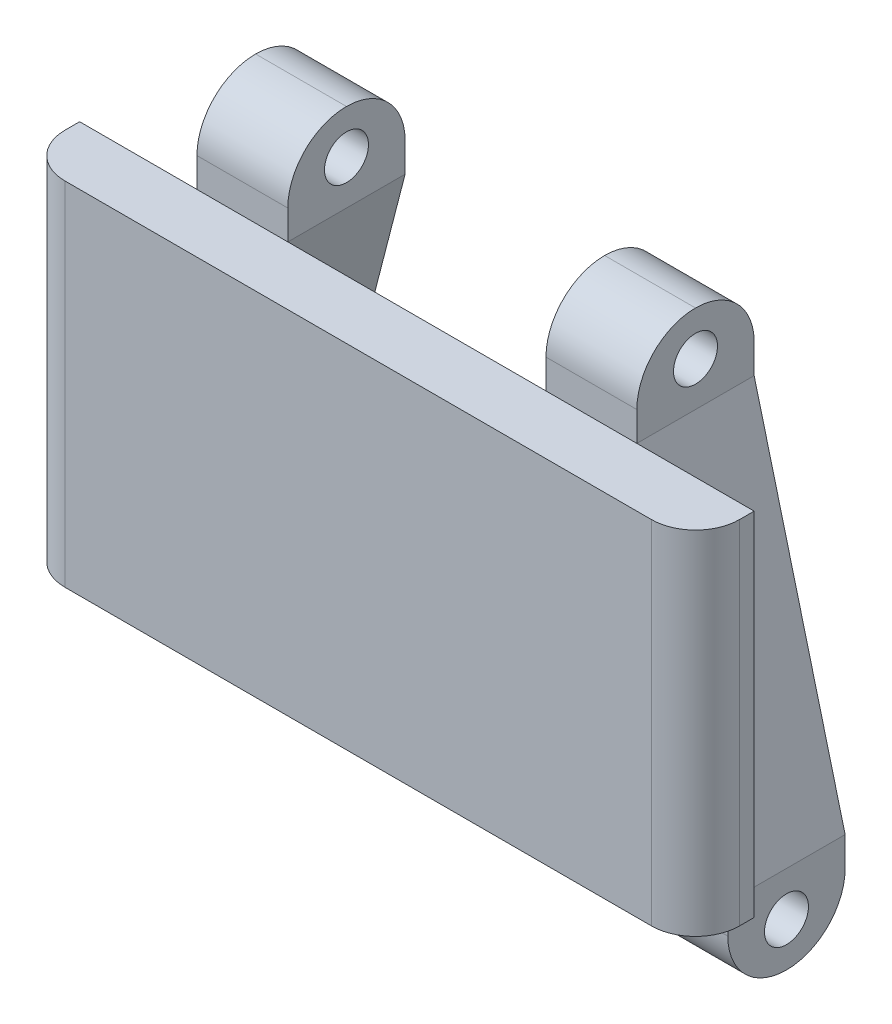
ISO-10303-21;
HEADER;
FILE_DESCRIPTION(('STEP AP214'),'2;1');
FILE_NAME('part.step','',(''),(''),'','','');
FILE_SCHEMA(('AUTOMOTIVE_DESIGN { 1 0 10303 214 1 1 1 1 }'));
ENDSEC;
DATA;
#1=APPLICATION_CONTEXT('core data for automotive mechanical design processes');
#2=APPLICATION_PROTOCOL_DEFINITION('international standard','automotive_design',2000,#1);
#3=PRODUCT_CONTEXT('',#1,'mechanical');
#4=PRODUCT('Part','Part','',(#3));
#5=PRODUCT_RELATED_PRODUCT_CATEGORY('part','',(#4));
#6=PRODUCT_DEFINITION_FORMATION('','',#4);
#7=PRODUCT_DEFINITION_CONTEXT('part definition',#1,'design');
#8=PRODUCT_DEFINITION('design','',#6,#7);
#9=PRODUCT_DEFINITION_SHAPE('','',#8);
#10=(LENGTH_UNIT() NAMED_UNIT(*) SI_UNIT(.MILLI.,.METRE.));
#11=(NAMED_UNIT(*) PLANE_ANGLE_UNIT() SI_UNIT($,.RADIAN.));
#12=(NAMED_UNIT(*) SI_UNIT($,.STERADIAN.) SOLID_ANGLE_UNIT());
#13=UNCERTAINTY_MEASURE_WITH_UNIT(LENGTH_MEASURE(1.E-05),#10,'distance_accuracy_value','');
#14=(GEOMETRIC_REPRESENTATION_CONTEXT(3) GLOBAL_UNCERTAINTY_ASSIGNED_CONTEXT((#13)) GLOBAL_UNIT_ASSIGNED_CONTEXT((#10,
#11,#12)) REPRESENTATION_CONTEXT('',''));
#15=CARTESIAN_POINT('',(0.,0.,0.));
#16=DIRECTION('',(0.,0.,1.));
#17=DIRECTION('',(1.,0.,0.));
#18=AXIS2_PLACEMENT_3D('',#15,#16,#17);
#19=CARTESIAN_POINT('',(0.,0.,0.));
#20=DIRECTION('',(0.,0.,-1.));
#21=DIRECTION('',(-1.,0.,0.));
#22=AXIS2_PLACEMENT_3D('',#19,#20,#21);
#23=PLANE('',#22);
#24=DIRECTION('',(-1.,0.,0.));
#25=VECTOR('',#24,1.);
#26=CARTESIAN_POINT('',(-11.5,6.,0.));
#27=LINE('',#26,#25);
#28=CARTESIAN_POINT('',(-7.5,6.,0.));
#29=VERTEX_POINT('',#28);
#30=CARTESIAN_POINT('',(-11.5,6.,0.));
#31=VERTEX_POINT('',#30);
#32=EDGE_CURVE('E364',#29,#31,#27,.T.);
#33=ORIENTED_EDGE('',*,*,#32,.F.);
#34=DIRECTION('',(0.250319006160222,0.968163413456095,0.));
#35=VECTOR('',#34,1.);
#36=CARTESIAN_POINT('',(-8.4841511844043,2.19358040499789,0.));
#37=LINE('',#36,#35);
#38=CARTESIAN_POINT('',(-10.6026044076586,-6.,0.));
#39=VERTEX_POINT('',#38);
#40=EDGE_CURVE('E276',#39,#29,#37,.T.);
#41=ORIENTED_EDGE('',*,*,#40,.F.);
#42=DIRECTION('',(1.,0.,0.));
#43=VECTOR('',#42,1.);
#44=CARTESIAN_POINT('',(-11.5,-6.,0.));
#45=LINE('',#44,#43);
#46=CARTESIAN_POINT('',(-11.5,-6.,0.));
#47=VERTEX_POINT('',#46);
#48=EDGE_CURVE('E356',#47,#39,#45,.T.);
#49=ORIENTED_EDGE('',*,*,#48,.F.);
#50=DIRECTION('',(0.,-1.,0.));
#51=VECTOR('',#50,1.);
#52=CARTESIAN_POINT('',(-11.5,-6.,0.));
#53=LINE('',#52,#51);
#54=EDGE_CURVE('E369',#31,#47,#53,.T.);
#55=ORIENTED_EDGE('',*,*,#54,.F.);
#56=EDGE_LOOP('',(#33,#41,#49,#55));
#57=FACE_BOUND('',#56,.T.);
#58=ADVANCED_FACE('F41',(#57),#23,.T.);
#59=CARTESIAN_POINT('',(10.6026044076586,-6.,0.));
#60=VERTEX_POINT('',#59);
#61=CARTESIAN_POINT('',(11.5,-6.,0.));
#62=VERTEX_POINT('',#61);
#63=EDGE_CURVE('E374',#60,#62,#45,.T.);
#64=ORIENTED_EDGE('',*,*,#63,.F.);
#65=DIRECTION('',(-0.250319006160223,0.968163413456095,0.));
#66=VECTOR('',#65,1.);
#67=CARTESIAN_POINT('',(8.4841511844043,2.19358040499789,0.));
#68=LINE('',#67,#66);
#69=CARTESIAN_POINT('',(7.5,6.,0.));
#70=VERTEX_POINT('',#69);
#71=EDGE_CURVE('E318',#60,#70,#68,.T.);
#72=ORIENTED_EDGE('',*,*,#71,.T.);
#73=CARTESIAN_POINT('',(11.5,6.,0.));
#74=VERTEX_POINT('',#73);
#75=EDGE_CURVE('E365',#74,#70,#27,.T.);
#76=ORIENTED_EDGE('',*,*,#75,.F.);
#77=DIRECTION('',(0.,1.,0.));
#78=VECTOR('',#77,1.);
#79=CARTESIAN_POINT('',(11.5,-6.,0.));
#80=LINE('',#79,#78);
#81=EDGE_CURVE('E350',#62,#74,#80,.T.);
#82=ORIENTED_EDGE('',*,*,#81,.F.);
#83=EDGE_LOOP('',(#64,#72,#76,#82));
#84=FACE_BOUND('',#83,.T.);
#85=ADVANCED_FACE('F552',(#84),#23,.T.);
#86=CARTESIAN_POINT('',(11.5,-6.,2.));
#87=DIRECTION('',(-1.,0.,0.));
#88=DIRECTION('',(0.,0.,1.));
#89=AXIS2_PLACEMENT_3D('',#86,#87,#88);
#90=PLANE('',#89);
#91=DIRECTION('',(0.,0.,-1.));
#92=VECTOR('',#91,1.);
#93=CARTESIAN_POINT('',(11.5,6.,2.));
#94=LINE('',#93,#92);
#95=CARTESIAN_POINT('',(11.5,6.,0.5));
#96=VERTEX_POINT('',#95);
#97=EDGE_CURVE('E391',#96,#74,#94,.T.);
#98=ORIENTED_EDGE('',*,*,#97,.F.);
#99=DIRECTION('',(0.,1.,0.));
#100=VECTOR('',#99,1.);
#101=CARTESIAN_POINT('',(11.5,-6.,0.5));
#102=LINE('',#101,#100);
#103=CARTESIAN_POINT('',(11.5,-6.,0.5));
#104=VERTEX_POINT('',#103);
#105=EDGE_CURVE('E417',#96,#104,#102,.F.);
#106=ORIENTED_EDGE('',*,*,#105,.T.);
#107=DIRECTION('',(0.,0.,-1.));
#108=VECTOR('',#107,1.);
#109=CARTESIAN_POINT('',(11.5,-6.,2.));
#110=LINE('',#109,#108);
#111=EDGE_CURVE('E360',#104,#62,#110,.T.);
#112=ORIENTED_EDGE('',*,*,#111,.T.);
#113=ORIENTED_EDGE('',*,*,#81,.T.);
#114=EDGE_LOOP('',(#98,#106,#112,#113));
#115=FACE_BOUND('',#114,.T.);
#116=ADVANCED_FACE('F559',(#115),#90,.F.);
#117=CARTESIAN_POINT('',(-11.5,6.,2.));
#118=DIRECTION('',(0.,-1.,0.));
#119=DIRECTION('',(0.,0.,-1.));
#120=AXIS2_PLACEMENT_3D('',#117,#118,#119);
#121=PLANE('',#120);
#122=DIRECTION('',(0.,0.,-1.));
#123=VECTOR('',#122,1.);
#124=CARTESIAN_POINT('',(-11.5,6.,2.));
#125=LINE('',#124,#123);
#126=CARTESIAN_POINT('',(-11.5,6.,0.5));
#127=VERTEX_POINT('',#126);
#128=EDGE_CURVE('E387',#127,#31,#125,.T.);
#129=ORIENTED_EDGE('',*,*,#128,.F.);
#130=CARTESIAN_POINT('',(-10.,6.,0.5));
#131=DIRECTION('',(0.,-1.,0.));
#132=DIRECTION('',(0.,0.,-1.));
#133=AXIS2_PLACEMENT_3D('',#130,#131,#132);
#134=CIRCLE('',#133,1.5);
#135=CARTESIAN_POINT('',(-10.,6.,2.));
#136=VERTEX_POINT('',#135);
#137=EDGE_CURVE('E414',#127,#136,#134,.F.);
#138=ORIENTED_EDGE('',*,*,#137,.T.);
#139=DIRECTION('',(-1.,0.,0.));
#140=VECTOR('',#139,1.);
#141=CARTESIAN_POINT('',(-11.5,6.,2.));
#142=LINE('',#141,#140);
#143=CARTESIAN_POINT('',(10.,6.,2.));
#144=VERTEX_POINT('',#143);
#145=EDGE_CURVE('E351',#144,#136,#142,.T.);
#146=ORIENTED_EDGE('',*,*,#145,.F.);
#147=CARTESIAN_POINT('',(10.,6.,0.5));
#148=DIRECTION('',(0.,-1.,0.));
#149=DIRECTION('',(0.,0.,-1.));
#150=AXIS2_PLACEMENT_3D('',#147,#148,#149);
#151=CIRCLE('',#150,1.5);
#152=EDGE_CURVE('E411',#144,#96,#151,.F.);
#153=ORIENTED_EDGE('',*,*,#152,.T.);
#154=ORIENTED_EDGE('',*,*,#97,.T.);
#155=ORIENTED_EDGE('',*,*,#75,.T.);
#156=CARTESIAN_POINT('',(4.40134954667335,6.,0.));
#157=VERTEX_POINT('',#156);
#158=EDGE_CURVE('E370',#70,#157,#27,.T.);
#159=ORIENTED_EDGE('',*,*,#158,.T.);
#160=CARTESIAN_POINT('',(-4.40134954667335,6.,0.));
#161=VERTEX_POINT('',#160);
#162=EDGE_CURVE('E581',#157,#161,#27,.T.);
#163=ORIENTED_EDGE('',*,*,#162,.T.);
#164=EDGE_CURVE('E588',#161,#29,#27,.T.);
#165=ORIENTED_EDGE('',*,*,#164,.T.);
#166=ORIENTED_EDGE('',*,*,#32,.T.);
#167=EDGE_LOOP('',(#129,#138,#146,#153,#154,#155,#159,#163,#165,#166));
#168=FACE_BOUND('',#167,.T.);
#169=ADVANCED_FACE('F587',(#168),#121,.F.);
#170=CARTESIAN_POINT('',(-11.5,-6.,2.));
#171=DIRECTION('',(1.,0.,0.));
#172=DIRECTION('',(0.,0.,-1.));
#173=AXIS2_PLACEMENT_3D('',#170,#171,#172);
#174=PLANE('',#173);
#175=DIRECTION('',(0.,0.,-1.));
#176=VECTOR('',#175,1.);
#177=CARTESIAN_POINT('',(-11.5,-6.,2.));
#178=LINE('',#177,#176);
#179=CARTESIAN_POINT('',(-11.5,-6.,0.5));
#180=VERTEX_POINT('',#179);
#181=EDGE_CURVE('E384',#180,#47,#178,.T.);
#182=ORIENTED_EDGE('',*,*,#181,.F.);
#183=DIRECTION('',(0.,-1.,0.));
#184=VECTOR('',#183,1.);
#185=CARTESIAN_POINT('',(-11.5,-6.,0.5));
#186=LINE('',#185,#184);
#187=EDGE_CURVE('E408',#180,#127,#186,.F.);
#188=ORIENTED_EDGE('',*,*,#187,.T.);
#189=ORIENTED_EDGE('',*,*,#128,.T.);
#190=ORIENTED_EDGE('',*,*,#54,.T.);
#191=EDGE_LOOP('',(#182,#188,#189,#190));
#192=FACE_BOUND('',#191,.T.);
#193=ADVANCED_FACE('F599',(#192),#174,.F.);
#194=CARTESIAN_POINT('',(-11.5,-6.,2.));
#195=DIRECTION('',(0.,1.,0.));
#196=DIRECTION('',(0.,0.,1.));
#197=AXIS2_PLACEMENT_3D('',#194,#195,#196);
#198=PLANE('',#197);
#199=DIRECTION('',(1.,0.,0.));
#200=VECTOR('',#199,1.);
#201=CARTESIAN_POINT('',(-11.5,-6.,2.));
#202=LINE('',#201,#200);
#203=CARTESIAN_POINT('',(-10.,-6.,2.));
#204=VERTEX_POINT('',#203);
#205=CARTESIAN_POINT('',(10.,-6.,2.));
#206=VERTEX_POINT('',#205);
#207=EDGE_CURVE('E355',#204,#206,#202,.T.);
#208=ORIENTED_EDGE('',*,*,#207,.F.);
#209=CARTESIAN_POINT('',(-10.,-6.,0.5));
#210=DIRECTION('',(0.,1.,0.));
#211=DIRECTION('',(0.,0.,1.));
#212=AXIS2_PLACEMENT_3D('',#209,#210,#211);
#213=CIRCLE('',#212,1.5);
#214=EDGE_CURVE('E405',#204,#180,#213,.F.);
#215=ORIENTED_EDGE('',*,*,#214,.T.);
#216=ORIENTED_EDGE('',*,*,#181,.T.);
#217=ORIENTED_EDGE('',*,*,#48,.T.);
#218=CARTESIAN_POINT('',(-7.50395395433195,-6.,0.));
#219=VERTEX_POINT('',#218);
#220=EDGE_CURVE('E378',#39,#219,#45,.T.);
#221=ORIENTED_EDGE('',*,*,#220,.T.);
#222=CARTESIAN_POINT('',(7.50395395433195,-6.,0.));
#223=VERTEX_POINT('',#222);
#224=EDGE_CURVE('E379',#219,#223,#45,.T.);
#225=ORIENTED_EDGE('',*,*,#224,.T.);
#226=EDGE_CURVE('E380',#223,#60,#45,.T.);
#227=ORIENTED_EDGE('',*,*,#226,.T.);
#228=ORIENTED_EDGE('',*,*,#63,.T.);
#229=ORIENTED_EDGE('',*,*,#111,.F.);
#230=CARTESIAN_POINT('',(10.,-6.,0.5));
#231=DIRECTION('',(0.,1.,0.));
#232=DIRECTION('',(0.,0.,1.));
#233=AXIS2_PLACEMENT_3D('',#230,#231,#232);
#234=CIRCLE('',#233,1.5);
#235=EDGE_CURVE('E402',#104,#206,#234,.F.);
#236=ORIENTED_EDGE('',*,*,#235,.T.);
#237=EDGE_LOOP('',(#208,#215,#216,#217,#221,#225,#227,#228,#229,#236));
#238=FACE_BOUND('',#237,.T.);
#239=ADVANCED_FACE('F575',(#238),#198,.F.);
#240=CARTESIAN_POINT('',(0.,0.,2.));
#241=DIRECTION('',(0.,0.,-1.));
#242=DIRECTION('',(-1.,0.,0.));
#243=AXIS2_PLACEMENT_3D('',#240,#241,#242);
#244=PLANE('',#243);
#245=ORIENTED_EDGE('',*,*,#145,.T.);
#246=DIRECTION('',(0.,-1.,0.));
#247=VECTOR('',#246,1.);
#248=CARTESIAN_POINT('',(-10.,0.,2.));
#249=LINE('',#248,#247);
#250=EDGE_CURVE('E398',#136,#204,#249,.T.);
#251=ORIENTED_EDGE('',*,*,#250,.T.);
#252=ORIENTED_EDGE('',*,*,#207,.T.);
#253=DIRECTION('',(0.,1.,0.));
#254=VECTOR('',#253,1.);
#255=CARTESIAN_POINT('',(10.,0.,2.));
#256=LINE('',#255,#254);
#257=EDGE_CURVE('E394',#206,#144,#256,.T.);
#258=ORIENTED_EDGE('',*,*,#257,.T.);
#259=EDGE_LOOP('',(#245,#251,#252,#258));
#260=FACE_BOUND('',#259,.T.);
#261=ADVANCED_FACE('F566',(#260),#244,.F.);
#262=DIRECTION('',(0.250319006160223,0.968163413456095,0.));
#263=VECTOR('',#262,1.);
#264=CARTESIAN_POINT('',(-5.57966094403601,1.44262338651722,0.));
#265=LINE('',#264,#263);
#266=EDGE_CURVE('E264',#219,#161,#265,.T.);
#267=ORIENTED_EDGE('',*,*,#266,.T.);
#268=ORIENTED_EDGE('',*,*,#162,.F.);
#269=DIRECTION('',(-0.250319006160223,0.968163413456095,0.));
#270=VECTOR('',#269,1.);
#271=CARTESIAN_POINT('',(5.57966094403601,1.44262338651722,0.));
#272=LINE('',#271,#270);
#273=EDGE_CURVE('E330',#223,#157,#272,.T.);
#274=ORIENTED_EDGE('',*,*,#273,.F.);
#275=ORIENTED_EDGE('',*,*,#224,.F.);
#276=EDGE_LOOP('',(#267,#268,#274,#275));
#277=FACE_BOUND('',#276,.T.);
#278=ADVANCED_FACE('F555',(#277),#23,.T.);
#279=CARTESIAN_POINT('',(-10.,0.,0.5));
#280=DIRECTION('',(0.,-1.,0.));
#281=DIRECTION('',(0.,0.,-1.));
#282=AXIS2_PLACEMENT_3D('',#279,#280,#281);
#283=CYLINDRICAL_SURFACE('',#282,1.5);
#284=ORIENTED_EDGE('',*,*,#137,.F.);
#285=ORIENTED_EDGE('',*,*,#187,.F.);
#286=ORIENTED_EDGE('',*,*,#214,.F.);
#287=ORIENTED_EDGE('',*,*,#250,.F.);
#288=EDGE_LOOP('',(#284,#285,#286,#287));
#289=FACE_BOUND('',#288,.T.);
#290=ADVANCED_FACE('F565',(#289),#283,.T.);
#291=CARTESIAN_POINT('',(10.,0.,0.5));
#292=DIRECTION('',(0.,1.,0.));
#293=DIRECTION('',(0.,0.,1.));
#294=AXIS2_PLACEMENT_3D('',#291,#292,#293);
#295=CYLINDRICAL_SURFACE('',#294,1.5);
#296=ORIENTED_EDGE('',*,*,#235,.F.);
#297=ORIENTED_EDGE('',*,*,#105,.F.);
#298=ORIENTED_EDGE('',*,*,#152,.F.);
#299=ORIENTED_EDGE('',*,*,#257,.F.);
#300=EDGE_LOOP('',(#296,#297,#298,#299));
#301=FACE_BOUND('',#300,.T.);
#302=ADVANCED_FACE('F572',(#301),#295,.T.);
#303=CARTESIAN_POINT('',(0.,0.,0.));
#304=DIRECTION('',(0.,0.,-1.));
#305=DIRECTION('',(-1.,0.,0.));
#306=AXIS2_PLACEMENT_3D('',#303,#304,#305);
#307=PLANE('',#306);
#308=DIRECTION('',(0.,-1.,0.));
#309=VECTOR('',#308,1.);
#310=CARTESIAN_POINT('',(7.50395395433195,0.,0.));
#311=LINE('',#310,#309);
#312=CARTESIAN_POINT('',(7.50395395433195,-7.,0.));
#313=VERTEX_POINT('',#312);
#314=EDGE_CURVE('E326',#223,#313,#311,.T.);
#315=ORIENTED_EDGE('',*,*,#314,.T.);
#316=DIRECTION('',(-1.,0.,0.));
#317=VECTOR('',#316,1.);
#318=CARTESIAN_POINT('',(0.,-7.,0.));
#319=LINE('',#318,#317);
#320=CARTESIAN_POINT('',(10.6026044076586,-7.,0.));
#321=VERTEX_POINT('',#320);
#322=EDGE_CURVE('E447',#313,#321,#319,.F.);
#323=ORIENTED_EDGE('',*,*,#322,.T.);
#324=DIRECTION('',(0.,-1.,0.));
#325=VECTOR('',#324,1.);
#326=CARTESIAN_POINT('',(10.6026044076586,0.,0.));
#327=LINE('',#326,#325);
#328=EDGE_CURVE('E322',#60,#321,#327,.T.);
#329=ORIENTED_EDGE('',*,*,#328,.F.);
#330=ORIENTED_EDGE('',*,*,#226,.F.);
#331=EDGE_LOOP('',(#315,#323,#329,#330));
#332=FACE_BOUND('',#331,.T.);
#333=ADVANCED_FACE('F645',(#332),#307,.F.);
#334=CARTESIAN_POINT('',(7.5,0.,-4.));
#335=DIRECTION('',(1.,0.,0.));
#336=DIRECTION('',(0.,0.,-1.));
#337=AXIS2_PLACEMENT_3D('',#334,#335,#336);
#338=PLANE('',#337);
#339=CARTESIAN_POINT('',(7.5,7.5,-2.));
#340=DIRECTION('',(1.,0.,0.));
#341=DIRECTION('',(0.,0.,-1.));
#342=AXIS2_PLACEMENT_3D('',#339,#340,#341);
#343=CIRCLE('',#342,0.749999999996326);
#344=CARTESIAN_POINT('',(7.5,7.5,-2.74999999999633));
#345=VERTEX_POINT('',#344);
#346=EDGE_CURVE('E513',#345,#345,#343,.T.);
#347=ORIENTED_EDGE('',*,*,#346,.F.);
#348=EDGE_LOOP('',(#347));
#349=FACE_BOUND('',#348,.T.);
#350=CARTESIAN_POINT('',(7.5,7.,-2.));
#351=DIRECTION('',(1.,0.,0.));
#352=DIRECTION('',(0.,0.,-1.));
#353=AXIS2_PLACEMENT_3D('',#350,#351,#352);
#354=CIRCLE('',#353,2.);
#355=CARTESIAN_POINT('',(7.5,7.,-4.));
#356=VERTEX_POINT('',#355);
#357=CARTESIAN_POINT('',(7.5,9.,-2.));
#358=VERTEX_POINT('',#357);
#359=EDGE_CURVE('E473',#356,#358,#354,.T.);
#360=ORIENTED_EDGE('',*,*,#359,.T.);
#361=CARTESIAN_POINT('',(7.5,7.,-2.));
#362=DIRECTION('',(1.,0.,0.));
#363=DIRECTION('',(0.,0.,-1.));
#364=AXIS2_PLACEMENT_3D('',#361,#362,#363);
#365=CIRCLE('',#364,2.);
#366=CARTESIAN_POINT('',(7.5,7.,0.));
#367=VERTEX_POINT('',#366);
#368=EDGE_CURVE('E476',#358,#367,#365,.T.);
#369=ORIENTED_EDGE('',*,*,#368,.T.);
#370=DIRECTION('',(0.,1.,0.));
#371=VECTOR('',#370,1.);
#372=CARTESIAN_POINT('',(7.5,0.,0.));
#373=LINE('',#372,#371);
#374=EDGE_CURVE('E228',#70,#367,#373,.T.);
#375=ORIENTED_EDGE('',*,*,#374,.F.);
#376=DIRECTION('',(0.,0.,1.));
#377=VECTOR('',#376,1.);
#378=CARTESIAN_POINT('',(7.5,6.,-4.));
#379=LINE('',#378,#377);
#380=CARTESIAN_POINT('',(7.5,6.,-4.));
#381=VERTEX_POINT('',#380);
#382=EDGE_CURVE('E346',#381,#70,#379,.T.);
#383=ORIENTED_EDGE('',*,*,#382,.F.);
#384=DIRECTION('',(0.,1.,0.));
#385=VECTOR('',#384,1.);
#386=CARTESIAN_POINT('',(7.5,0.,-4.));
#387=LINE('',#386,#385);
#388=EDGE_CURVE('E290',#381,#356,#387,.T.);
#389=ORIENTED_EDGE('',*,*,#388,.T.);
#390=EDGE_LOOP('',(#360,#369,#375,#383,#389));
#391=FACE_BOUND('',#390,.T.);
#392=ADVANCED_FACE('F661',(#349,#391),#338,.T.);
#393=CARTESIAN_POINT('',(8.4841511844043,2.19358040499789,-4.));
#394=DIRECTION('',(0.968163413456095,0.250319006160223,0.));
#395=DIRECTION('',(-0.250319006160223,0.968163413456095,0.));
#396=AXIS2_PLACEMENT_3D('',#393,#394,#395);
#397=PLANE('',#396);
#398=ORIENTED_EDGE('',*,*,#71,.F.);
#399=DIRECTION('',(0.,0.,1.));
#400=VECTOR('',#399,1.);
#401=CARTESIAN_POINT('',(10.6026044076586,-6.,-4.));
#402=LINE('',#401,#400);
#403=CARTESIAN_POINT('',(10.6026044076586,-6.,-4.));
#404=VERTEX_POINT('',#403);
#405=EDGE_CURVE('E343',#404,#60,#402,.T.);
#406=ORIENTED_EDGE('',*,*,#405,.F.);
#407=DIRECTION('',(-0.250319006160223,0.968163413456095,0.));
#408=VECTOR('',#407,1.);
#409=CARTESIAN_POINT('',(8.4841511844043,2.19358040499789,-4.));
#410=LINE('',#409,#408);
#411=EDGE_CURVE('E294',#404,#381,#410,.T.);
#412=ORIENTED_EDGE('',*,*,#411,.T.);
#413=ORIENTED_EDGE('',*,*,#382,.T.);
#414=EDGE_LOOP('',(#398,#406,#412,#413));
#415=FACE_BOUND('',#414,.T.);
#416=ADVANCED_FACE('F620',(#415),#397,.T.);
#417=CARTESIAN_POINT('',(10.6026044076586,0.,-4.));
#418=DIRECTION('',(-1.,0.,0.));
#419=DIRECTION('',(0.,0.,1.));
#420=AXIS2_PLACEMENT_3D('',#417,#418,#419);
#421=PLANE('',#420);
#422=CARTESIAN_POINT('',(10.6026044076586,-7.5,-2.));
#423=DIRECTION('',(-1.,0.,0.));
#424=DIRECTION('',(0.,0.,1.));
#425=AXIS2_PLACEMENT_3D('',#422,#423,#424);
#426=CIRCLE('',#425,0.74999999999632);
#427=CARTESIAN_POINT('',(10.6026044076586,-7.5,-1.25000000000368));
#428=VERTEX_POINT('',#427);
#429=EDGE_CURVE('E45',#428,#428,#426,.T.);
#430=ORIENTED_EDGE('',*,*,#429,.T.);
#431=EDGE_LOOP('',(#430));
#432=FACE_BOUND('',#431,.T.);
#433=ORIENTED_EDGE('',*,*,#328,.T.);
#434=CARTESIAN_POINT('',(10.6026044076586,-7.,-2.));
#435=DIRECTION('',(-1.,0.,0.));
#436=DIRECTION('',(0.,0.,1.));
#437=AXIS2_PLACEMENT_3D('',#434,#435,#436);
#438=CIRCLE('',#437,2.);
#439=CARTESIAN_POINT('',(10.6026044076586,-9.,-2.));
#440=VERTEX_POINT('',#439);
#441=EDGE_CURVE('E454',#321,#440,#438,.F.);
#442=ORIENTED_EDGE('',*,*,#441,.T.);
#443=CARTESIAN_POINT('',(10.6026044076586,-7.,-2.));
#444=DIRECTION('',(-1.,0.,0.));
#445=DIRECTION('',(0.,0.,1.));
#446=AXIS2_PLACEMENT_3D('',#443,#444,#445);
#447=CIRCLE('',#446,2.);
#448=CARTESIAN_POINT('',(10.6026044076586,-7.,-4.));
#449=VERTEX_POINT('',#448);
#450=EDGE_CURVE('E451',#440,#449,#447,.F.);
#451=ORIENTED_EDGE('',*,*,#450,.T.);
#452=DIRECTION('',(0.,-1.,0.));
#453=VECTOR('',#452,1.);
#454=CARTESIAN_POINT('',(10.6026044076586,0.,-4.));
#455=LINE('',#454,#453);
#456=EDGE_CURVE('E299',#404,#449,#455,.T.);
#457=ORIENTED_EDGE('',*,*,#456,.F.);
#458=ORIENTED_EDGE('',*,*,#405,.T.);
#459=EDGE_LOOP('',(#433,#442,#451,#457,#458));
#460=FACE_BOUND('',#459,.T.);
#461=ADVANCED_FACE('F652',(#432,#460),#421,.F.);
#462=CARTESIAN_POINT('',(7.50395395433195,0.,-4.));
#463=DIRECTION('',(-1.,0.,0.));
#464=DIRECTION('',(0.,-1.,0.));
#465=AXIS2_PLACEMENT_3D('',#462,#463,#464);
#466=PLANE('',#465);
#467=CARTESIAN_POINT('',(7.50395395433195,-7.5,-2.));
#468=DIRECTION('',(-1.,0.,0.));
#469=DIRECTION('',(0.,-1.,0.));
#470=AXIS2_PLACEMENT_3D('',#467,#468,#469);
#471=CIRCLE('',#470,0.74999999999632);
#472=CARTESIAN_POINT('',(7.50395395433195,-8.24999999999632,-2.));
#473=VERTEX_POINT('',#472);
#474=EDGE_CURVE('E521',#473,#473,#471,.T.);
#475=ORIENTED_EDGE('',*,*,#474,.F.);
#476=EDGE_LOOP('',(#475));
#477=FACE_BOUND('',#476,.T.);
#478=CARTESIAN_POINT('',(7.50395395433195,-7.,-2.));
#479=DIRECTION('',(-1.,0.,0.));
#480=DIRECTION('',(0.,-1.,0.));
#481=AXIS2_PLACEMENT_3D('',#478,#479,#480);
#482=CIRCLE('',#481,2.);
#483=CARTESIAN_POINT('',(7.50395395433195,-7.,-4.));
#484=VERTEX_POINT('',#483);
#485=CARTESIAN_POINT('',(7.50395395433195,-9.,-2.));
#486=VERTEX_POINT('',#485);
#487=EDGE_CURVE('E441',#484,#486,#482,.T.);
#488=ORIENTED_EDGE('',*,*,#487,.T.);
#489=CARTESIAN_POINT('',(7.50395395433195,-7.,-2.));
#490=DIRECTION('',(-1.,0.,0.));
#491=DIRECTION('',(0.,-1.,0.));
#492=AXIS2_PLACEMENT_3D('',#489,#490,#491);
#493=CIRCLE('',#492,2.);
#494=EDGE_CURVE('E444',#486,#313,#493,.T.);
#495=ORIENTED_EDGE('',*,*,#494,.T.);
#496=ORIENTED_EDGE('',*,*,#314,.F.);
#497=DIRECTION('',(0.,0.,1.));
#498=VECTOR('',#497,1.);
#499=CARTESIAN_POINT('',(7.50395395433195,-6.,-4.));
#500=LINE('',#499,#498);
#501=CARTESIAN_POINT('',(7.50395395433195,-6.,-4.));
#502=VERTEX_POINT('',#501);
#503=EDGE_CURVE('E339',#502,#223,#500,.T.);
#504=ORIENTED_EDGE('',*,*,#503,.F.);
#505=DIRECTION('',(0.,-1.,0.));
#506=VECTOR('',#505,1.);
#507=CARTESIAN_POINT('',(7.50395395433195,0.,-4.));
#508=LINE('',#507,#506);
#509=EDGE_CURVE('E303',#502,#484,#508,.T.);
#510=ORIENTED_EDGE('',*,*,#509,.T.);
#511=EDGE_LOOP('',(#488,#495,#496,#504,#510));
#512=FACE_BOUND('',#511,.T.);
#513=ADVANCED_FACE('F640',(#477,#512),#466,.T.);
#514=CARTESIAN_POINT('',(5.57966094403601,1.44262338651722,-4.));
#515=DIRECTION('',(0.968163413456095,0.250319006160223,0.));
#516=DIRECTION('',(-0.250319006160223,0.968163413456095,0.));
#517=AXIS2_PLACEMENT_3D('',#514,#515,#516);
#518=PLANE('',#517);
#519=ORIENTED_EDGE('',*,*,#273,.T.);
#520=DIRECTION('',(0.,0.,1.));
#521=VECTOR('',#520,1.);
#522=CARTESIAN_POINT('',(4.40134954667335,6.,-4.));
#523=LINE('',#522,#521);
#524=CARTESIAN_POINT('',(4.40134954667335,6.,-4.));
#525=VERTEX_POINT('',#524);
#526=EDGE_CURVE('E314',#525,#157,#523,.T.);
#527=ORIENTED_EDGE('',*,*,#526,.F.);
#528=DIRECTION('',(-0.250319006160223,0.968163413456095,0.));
#529=VECTOR('',#528,1.);
#530=CARTESIAN_POINT('',(5.57966094403601,1.44262338651722,-4.));
#531=LINE('',#530,#529);
#532=EDGE_CURVE('E307',#502,#525,#531,.T.);
#533=ORIENTED_EDGE('',*,*,#532,.F.);
#534=ORIENTED_EDGE('',*,*,#503,.T.);
#535=EDGE_LOOP('',(#519,#527,#533,#534));
#536=FACE_BOUND('',#535,.T.);
#537=ADVANCED_FACE('F636',(#536),#518,.F.);
#538=CARTESIAN_POINT('',(4.40134954667335,0.,-4.));
#539=DIRECTION('',(1.,0.,0.));
#540=DIRECTION('',(0.,0.,-1.));
#541=AXIS2_PLACEMENT_3D('',#538,#539,#540);
#542=PLANE('',#541);
#543=CARTESIAN_POINT('',(4.40134954667335,7.5,-2.));
#544=DIRECTION('',(1.,0.,0.));
#545=DIRECTION('',(0.,0.,-1.));
#546=AXIS2_PLACEMENT_3D('',#543,#544,#545);
#547=CIRCLE('',#546,0.749999999994489);
#548=CARTESIAN_POINT('',(4.40134954667335,7.5,-2.74999999999449));
#549=VERTEX_POINT('',#548);
#550=EDGE_CURVE('E508',#549,#549,#547,.T.);
#551=ORIENTED_EDGE('',*,*,#550,.T.);
#552=EDGE_LOOP('',(#551));
#553=FACE_BOUND('',#552,.T.);
#554=DIRECTION('',(0.,1.,0.));
#555=VECTOR('',#554,1.);
#556=CARTESIAN_POINT('',(4.40134954667335,0.,0.));
#557=LINE('',#556,#555);
#558=CARTESIAN_POINT('',(4.40134954667335,7.,0.));
#559=VERTEX_POINT('',#558);
#560=EDGE_CURVE('E295',#157,#559,#557,.T.);
#561=ORIENTED_EDGE('',*,*,#560,.T.);
#562=CARTESIAN_POINT('',(4.40134954667335,7.,-2.));
#563=DIRECTION('',(1.,0.,0.));
#564=DIRECTION('',(0.,0.,-1.));
#565=AXIS2_PLACEMENT_3D('',#562,#563,#564);
#566=CIRCLE('',#565,2.);
#567=CARTESIAN_POINT('',(4.40134954667335,9.,-2.));
#568=VERTEX_POINT('',#567);
#569=EDGE_CURVE('E470',#559,#568,#566,.F.);
#570=ORIENTED_EDGE('',*,*,#569,.T.);
#571=CARTESIAN_POINT('',(4.40134954667335,7.,-2.));
#572=DIRECTION('',(1.,0.,0.));
#573=DIRECTION('',(0.,0.,-1.));
#574=AXIS2_PLACEMENT_3D('',#571,#572,#573);
#575=CIRCLE('',#574,2.);
#576=CARTESIAN_POINT('',(4.40134954667335,7.,-4.));
#577=VERTEX_POINT('',#576);
#578=EDGE_CURVE('E467',#568,#577,#575,.F.);
#579=ORIENTED_EDGE('',*,*,#578,.T.);
#580=DIRECTION('',(0.,1.,0.));
#581=VECTOR('',#580,1.);
#582=CARTESIAN_POINT('',(4.40134954667335,0.,-4.));
#583=LINE('',#582,#581);
#584=EDGE_CURVE('E310',#525,#577,#583,.T.);
#585=ORIENTED_EDGE('',*,*,#584,.F.);
#586=ORIENTED_EDGE('',*,*,#526,.T.);
#587=EDGE_LOOP('',(#561,#570,#579,#585,#586));
#588=FACE_BOUND('',#587,.T.);
#589=ADVANCED_FACE('F630',(#553,#588),#542,.F.);
#590=CARTESIAN_POINT('',(0.,0.,-4.));
#591=DIRECTION('',(0.,0.,-1.));
#592=DIRECTION('',(-1.,0.,0.));
#593=AXIS2_PLACEMENT_3D('',#590,#591,#592);
#594=PLANE('',#593);
#595=ORIENTED_EDGE('',*,*,#456,.T.);
#596=DIRECTION('',(-1.,0.,0.));
#597=VECTOR('',#596,1.);
#598=CARTESIAN_POINT('',(7.50395395433195,-7.,-4.));
#599=LINE('',#598,#597);
#600=EDGE_CURVE('E460',#449,#484,#599,.T.);
#601=ORIENTED_EDGE('',*,*,#600,.T.);
#602=ORIENTED_EDGE('',*,*,#509,.F.);
#603=ORIENTED_EDGE('',*,*,#532,.T.);
#604=ORIENTED_EDGE('',*,*,#584,.T.);
#605=DIRECTION('',(-1.,0.,0.));
#606=VECTOR('',#605,1.);
#607=CARTESIAN_POINT('',(0.,7.,-4.));
#608=LINE('',#607,#606);
#609=EDGE_CURVE('E457',#577,#356,#608,.F.);
#610=ORIENTED_EDGE('',*,*,#609,.T.);
#611=ORIENTED_EDGE('',*,*,#388,.F.);
#612=ORIENTED_EDGE('',*,*,#411,.F.);
#613=EDGE_LOOP('',(#595,#601,#602,#603,#604,#610,#611,#612));
#614=FACE_BOUND('',#613,.T.);
#615=ADVANCED_FACE('F658',(#614),#594,.T.);
#616=ORIENTED_EDGE('',*,*,#374,.T.);
#617=DIRECTION('',(-1.,0.,0.));
#618=VECTOR('',#617,1.);
#619=CARTESIAN_POINT('',(4.40134954667335,7.,0.));
#620=LINE('',#619,#618);
#621=EDGE_CURVE('E463',#367,#559,#620,.T.);
#622=ORIENTED_EDGE('',*,*,#621,.T.);
#623=ORIENTED_EDGE('',*,*,#560,.F.);
#624=ORIENTED_EDGE('',*,*,#158,.F.);
#625=EDGE_LOOP('',(#616,#622,#623,#624));
#626=FACE_BOUND('',#625,.T.);
#627=ADVANCED_FACE('F627',(#626),#307,.F.);
#628=CARTESIAN_POINT('',(0.,0.,0.));
#629=DIRECTION('',(0.,0.,-1.));
#630=DIRECTION('',(-1.,0.,0.));
#631=AXIS2_PLACEMENT_3D('',#628,#629,#630);
#632=PLANE('',#631);
#633=DIRECTION('',(0.,1.,0.));
#634=VECTOR('',#633,1.);
#635=CARTESIAN_POINT('',(-4.40134954667335,0.,0.));
#636=LINE('',#635,#634);
#637=CARTESIAN_POINT('',(-4.40134954667335,7.,0.));
#638=VERTEX_POINT('',#637);
#639=EDGE_CURVE('E222',#161,#638,#636,.T.);
#640=ORIENTED_EDGE('',*,*,#639,.T.);
#641=DIRECTION('',(1.,0.,0.));
#642=VECTOR('',#641,1.);
#643=CARTESIAN_POINT('',(0.,7.,0.));
#644=LINE('',#643,#642);
#645=CARTESIAN_POINT('',(-7.5,7.,0.));
#646=VERTEX_POINT('',#645);
#647=EDGE_CURVE('E485',#638,#646,#644,.F.);
#648=ORIENTED_EDGE('',*,*,#647,.T.);
#649=DIRECTION('',(0.,1.,0.));
#650=VECTOR('',#649,1.);
#651=CARTESIAN_POINT('',(-7.5,0.,0.));
#652=LINE('',#651,#650);
#653=EDGE_CURVE('E240',#29,#646,#652,.T.);
#654=ORIENTED_EDGE('',*,*,#653,.F.);
#655=ORIENTED_EDGE('',*,*,#164,.F.);
#656=EDGE_LOOP('',(#640,#648,#654,#655));
#657=FACE_BOUND('',#656,.T.);
#658=ADVANCED_FACE('F834',(#657),#632,.F.);
#659=DIRECTION('',(0.,-1.,0.));
#660=VECTOR('',#659,1.);
#661=CARTESIAN_POINT('',(-10.6026044076586,0.,0.));
#662=LINE('',#661,#660);
#663=CARTESIAN_POINT('',(-10.6026044076586,-7.00000000000001,0.));
#664=VERTEX_POINT('',#663);
#665=EDGE_CURVE('E272',#39,#664,#662,.T.);
#666=ORIENTED_EDGE('',*,*,#665,.T.);
#667=DIRECTION('',(1.,0.,0.));
#668=VECTOR('',#667,1.);
#669=CARTESIAN_POINT('',(-7.50395395433195,-7.,0.));
#670=LINE('',#669,#668);
#671=CARTESIAN_POINT('',(-7.50395395433195,-7.,0.));
#672=VERTEX_POINT('',#671);
#673=EDGE_CURVE('E438',#664,#672,#670,.T.);
#674=ORIENTED_EDGE('',*,*,#673,.T.);
#675=DIRECTION('',(0.,-1.,0.));
#676=VECTOR('',#675,1.);
#677=CARTESIAN_POINT('',(-7.50395395433195,0.,0.));
#678=LINE('',#677,#676);
#679=EDGE_CURVE('E268',#219,#672,#678,.T.);
#680=ORIENTED_EDGE('',*,*,#679,.F.);
#681=ORIENTED_EDGE('',*,*,#220,.F.);
#682=EDGE_LOOP('',(#666,#674,#680,#681));
#683=FACE_BOUND('',#682,.T.);
#684=ADVANCED_FACE('F847',(#683),#632,.F.);
#685=CARTESIAN_POINT('',(-4.40134954667335,0.,-4.));
#686=DIRECTION('',(1.,0.,0.));
#687=DIRECTION('',(0.,0.,-1.));
#688=AXIS2_PLACEMENT_3D('',#685,#686,#687);
#689=PLANE('',#688);
#690=CARTESIAN_POINT('',(-4.40134954667335,7.5,-2.));
#691=DIRECTION('',(1.,0.,0.));
#692=DIRECTION('',(0.,0.,-1.));
#693=AXIS2_PLACEMENT_3D('',#690,#691,#692);
#694=CIRCLE('',#693,0.749999999994489);
#695=CARTESIAN_POINT('',(-4.40134954667335,7.5,-2.74999999999449));
#696=VERTEX_POINT('',#695);
#697=EDGE_CURVE('E509',#696,#696,#694,.T.);
#698=ORIENTED_EDGE('',*,*,#697,.F.);
#699=EDGE_LOOP('',(#698));
#700=FACE_BOUND('',#699,.T.);
#701=CARTESIAN_POINT('',(-4.40134954667335,7.,-2.));
#702=DIRECTION('',(1.,0.,0.));
#703=DIRECTION('',(0.,0.,-1.));
#704=AXIS2_PLACEMENT_3D('',#701,#702,#703);
#705=CIRCLE('',#704,2.);
#706=CARTESIAN_POINT('',(-4.40134954667335,7.,-4.));
#707=VERTEX_POINT('',#706);
#708=CARTESIAN_POINT('',(-4.40134954667335,9.,-2.));
#709=VERTEX_POINT('',#708);
#710=EDGE_CURVE('E479',#707,#709,#705,.T.);
#711=ORIENTED_EDGE('',*,*,#710,.T.);
#712=CARTESIAN_POINT('',(-4.40134954667335,7.,-2.));
#713=DIRECTION('',(1.,0.,0.));
#714=DIRECTION('',(0.,0.,-1.));
#715=AXIS2_PLACEMENT_3D('',#712,#713,#714);
#716=CIRCLE('',#715,2.);
#717=EDGE_CURVE('E482',#709,#638,#716,.T.);
#718=ORIENTED_EDGE('',*,*,#717,.T.);
#719=ORIENTED_EDGE('',*,*,#639,.F.);
#720=DIRECTION('',(0.,0.,1.));
#721=VECTOR('',#720,1.);
#722=CARTESIAN_POINT('',(-4.40134954667335,6.,-4.));
#723=LINE('',#722,#721);
#724=CARTESIAN_POINT('',(-4.40134954667335,6.,-4.));
#725=VERTEX_POINT('',#724);
#726=EDGE_CURVE('E216',#725,#161,#723,.T.);
#727=ORIENTED_EDGE('',*,*,#726,.F.);
#728=DIRECTION('',(0.,1.,0.));
#729=VECTOR('',#728,1.);
#730=CARTESIAN_POINT('',(-4.40134954667335,0.,-4.));
#731=LINE('',#730,#729);
#732=EDGE_CURVE('E219',#725,#707,#731,.T.);
#733=ORIENTED_EDGE('',*,*,#732,.T.);
#734=EDGE_LOOP('',(#711,#718,#719,#727,#733));
#735=FACE_BOUND('',#734,.T.);
#736=ADVANCED_FACE('F218',(#700,#735),#689,.T.);
#737=CARTESIAN_POINT('',(-5.57966094403601,1.44262338651722,-4.));
#738=DIRECTION('',(0.968163413456095,-0.250319006160223,0.));
#739=DIRECTION('',(0.250319006160223,0.968163413456095,0.));
#740=AXIS2_PLACEMENT_3D('',#737,#738,#739);
#741=PLANE('',#740);
#742=ORIENTED_EDGE('',*,*,#266,.F.);
#743=DIRECTION('',(0.,0.,1.));
#744=VECTOR('',#743,1.);
#745=CARTESIAN_POINT('',(-7.50395395433195,-6.,-4.));
#746=LINE('',#745,#744);
#747=CARTESIAN_POINT('',(-7.50395395433195,-6.,-4.));
#748=VERTEX_POINT('',#747);
#749=EDGE_CURVE('E229',#748,#219,#746,.T.);
#750=ORIENTED_EDGE('',*,*,#749,.F.);
#751=DIRECTION('',(0.250319006160223,0.968163413456095,0.));
#752=VECTOR('',#751,1.);
#753=CARTESIAN_POINT('',(-5.57966094403601,1.44262338651722,-4.));
#754=LINE('',#753,#752);
#755=EDGE_CURVE('E235',#748,#725,#754,.T.);
#756=ORIENTED_EDGE('',*,*,#755,.T.);
#757=ORIENTED_EDGE('',*,*,#726,.T.);
#758=EDGE_LOOP('',(#742,#750,#756,#757));
#759=FACE_BOUND('',#758,.T.);
#760=ADVANCED_FACE('F242',(#759),#741,.T.);
#761=CARTESIAN_POINT('',(-7.50395395433195,0.,-4.));
#762=DIRECTION('',(-1.,0.,0.));
#763=DIRECTION('',(0.,-1.,0.));
#764=AXIS2_PLACEMENT_3D('',#761,#762,#763);
#765=PLANE('',#764);
#766=CARTESIAN_POINT('',(-7.50395395433195,-7.5,-2.));
#767=DIRECTION('',(-1.,0.,0.));
#768=DIRECTION('',(0.,-1.,0.));
#769=AXIS2_PLACEMENT_3D('',#766,#767,#768);
#770=CIRCLE('',#769,0.749999999994489);
#771=CARTESIAN_POINT('',(-7.50395395433195,-8.24999999999449,-2.));
#772=VERTEX_POINT('',#771);
#773=EDGE_CURVE('E504',#772,#772,#770,.T.);
#774=ORIENTED_EDGE('',*,*,#773,.T.);
#775=EDGE_LOOP('',(#774));
#776=FACE_BOUND('',#775,.T.);
#777=CARTESIAN_POINT('',(-7.50395395433195,-7.,-2.));
#778=DIRECTION('',(-1.,0.,0.));
#779=DIRECTION('',(0.,-1.,0.));
#780=AXIS2_PLACEMENT_3D('',#777,#778,#779);
#781=CIRCLE('',#780,2.);
#782=CARTESIAN_POINT('',(-7.50395395433195,-9.,-2.));
#783=VERTEX_POINT('',#782);
#784=EDGE_CURVE('E420',#672,#783,#781,.F.);
#785=ORIENTED_EDGE('',*,*,#784,.T.);
#786=CARTESIAN_POINT('',(-7.50395395433195,-7.,-2.));
#787=DIRECTION('',(-1.,0.,0.));
#788=DIRECTION('',(0.,-1.,0.));
#789=AXIS2_PLACEMENT_3D('',#786,#787,#788);
#790=CIRCLE('',#789,2.);
#791=CARTESIAN_POINT('',(-7.50395395433195,-7.,-4.));
#792=VERTEX_POINT('',#791);
#793=EDGE_CURVE('E423',#783,#792,#790,.F.);
#794=ORIENTED_EDGE('',*,*,#793,.T.);
#795=DIRECTION('',(0.,-1.,0.));
#796=VECTOR('',#795,1.);
#797=CARTESIAN_POINT('',(-7.50395395433195,0.,-4.));
#798=LINE('',#797,#796);
#799=EDGE_CURVE('E245',#748,#792,#798,.T.);
#800=ORIENTED_EDGE('',*,*,#799,.F.);
#801=ORIENTED_EDGE('',*,*,#749,.T.);
#802=ORIENTED_EDGE('',*,*,#679,.T.);
#803=EDGE_LOOP('',(#785,#794,#800,#801,#802));
#804=FACE_BOUND('',#803,.T.);
#805=ADVANCED_FACE('F535',(#776,#804),#765,.F.);
#806=CARTESIAN_POINT('',(-10.6026044076586,0.,-4.));
#807=DIRECTION('',(-1.,0.,0.));
#808=DIRECTION('',(0.,0.,1.));
#809=AXIS2_PLACEMENT_3D('',#806,#807,#808);
#810=PLANE('',#809);
#811=CARTESIAN_POINT('',(-10.6026044076586,-7.5,-2.));
#812=DIRECTION('',(-1.,0.,0.));
#813=DIRECTION('',(0.,0.,1.));
#814=AXIS2_PLACEMENT_3D('',#811,#812,#813);
#815=CIRCLE('',#814,0.749999999994489);
#816=CARTESIAN_POINT('',(-10.6026044076586,-7.5,-1.25000000000551));
#817=VERTEX_POINT('',#816);
#818=EDGE_CURVE('E505',#817,#817,#815,.T.);
#819=ORIENTED_EDGE('',*,*,#818,.F.);
#820=EDGE_LOOP('',(#819));
#821=FACE_BOUND('',#820,.T.);
#822=DIRECTION('',(0.,-1.,0.));
#823=VECTOR('',#822,1.);
#824=CARTESIAN_POINT('',(-10.6026044076586,0.,-4.));
#825=LINE('',#824,#823);
#826=CARTESIAN_POINT('',(-10.6026044076586,-6.,-4.));
#827=VERTEX_POINT('',#826);
#828=CARTESIAN_POINT('',(-10.6026044076586,-7.00000000000001,-4.));
#829=VERTEX_POINT('',#828);
#830=EDGE_CURVE('E248',#827,#829,#825,.T.);
#831=ORIENTED_EDGE('',*,*,#830,.T.);
#832=CARTESIAN_POINT('',(-10.6026044076586,-7.00000000000001,-2.));
#833=DIRECTION('',(-1.,0.,0.));
#834=DIRECTION('',(0.,0.,1.));
#835=AXIS2_PLACEMENT_3D('',#832,#833,#834);
#836=CIRCLE('',#835,2.);
#837=CARTESIAN_POINT('',(-10.6026044076586,-9.00000000000001,-2.));
#838=VERTEX_POINT('',#837);
#839=EDGE_CURVE('E435',#829,#838,#836,.T.);
#840=ORIENTED_EDGE('',*,*,#839,.T.);
#841=CARTESIAN_POINT('',(-10.6026044076586,-7.00000000000001,-2.));
#842=DIRECTION('',(-1.,0.,0.));
#843=DIRECTION('',(0.,0.,1.));
#844=AXIS2_PLACEMENT_3D('',#841,#842,#843);
#845=CIRCLE('',#844,2.);
#846=EDGE_CURVE('E432',#838,#664,#845,.T.);
#847=ORIENTED_EDGE('',*,*,#846,.T.);
#848=ORIENTED_EDGE('',*,*,#665,.F.);
#849=DIRECTION('',(0.,0.,1.));
#850=VECTOR('',#849,1.);
#851=CARTESIAN_POINT('',(-10.6026044076586,-6.,-4.));
#852=LINE('',#851,#850);
#853=EDGE_CURVE('E284',#827,#39,#852,.T.);
#854=ORIENTED_EDGE('',*,*,#853,.F.);
#855=EDGE_LOOP('',(#831,#840,#847,#848,#854));
#856=FACE_BOUND('',#855,.T.);
#857=ADVANCED_FACE('F889',(#821,#856),#810,.T.);
#858=CARTESIAN_POINT('',(-8.4841511844043,2.19358040499789,-4.));
#859=DIRECTION('',(0.968163413456095,-0.250319006160222,0.));
#860=DIRECTION('',(0.250319006160222,0.968163413456095,0.));
#861=AXIS2_PLACEMENT_3D('',#858,#859,#860);
#862=PLANE('',#861);
#863=ORIENTED_EDGE('',*,*,#40,.T.);
#864=DIRECTION('',(0.,0.,1.));
#865=VECTOR('',#864,1.);
#866=CARTESIAN_POINT('',(-7.5,6.,-4.));
#867=LINE('',#866,#865);
#868=CARTESIAN_POINT('',(-7.5,6.,-4.));
#869=VERTEX_POINT('',#868);
#870=EDGE_CURVE('E261',#869,#29,#867,.T.);
#871=ORIENTED_EDGE('',*,*,#870,.F.);
#872=DIRECTION('',(0.250319006160222,0.968163413456095,0.));
#873=VECTOR('',#872,1.);
#874=CARTESIAN_POINT('',(-8.4841511844043,2.19358040499789,-4.));
#875=LINE('',#874,#873);
#876=EDGE_CURVE('E255',#827,#869,#875,.T.);
#877=ORIENTED_EDGE('',*,*,#876,.F.);
#878=ORIENTED_EDGE('',*,*,#853,.T.);
#879=EDGE_LOOP('',(#863,#871,#877,#878));
#880=FACE_BOUND('',#879,.T.);
#881=ADVANCED_FACE('F897',(#880),#862,.F.);
#882=CARTESIAN_POINT('',(-7.5,0.,-4.));
#883=DIRECTION('',(1.,0.,0.));
#884=DIRECTION('',(0.,0.,-1.));
#885=AXIS2_PLACEMENT_3D('',#882,#883,#884);
#886=PLANE('',#885);
#887=CARTESIAN_POINT('',(-7.5,7.5,-2.));
#888=DIRECTION('',(1.,0.,0.));
#889=DIRECTION('',(0.,0.,-1.));
#890=AXIS2_PLACEMENT_3D('',#887,#888,#889);
#891=CIRCLE('',#890,0.749999999994489);
#892=CARTESIAN_POINT('',(-7.5,7.5,-2.74999999999449));
#893=VERTEX_POINT('',#892);
#894=EDGE_CURVE('E512',#893,#893,#891,.T.);
#895=ORIENTED_EDGE('',*,*,#894,.T.);
#896=EDGE_LOOP('',(#895));
#897=FACE_BOUND('',#896,.T.);
#898=ORIENTED_EDGE('',*,*,#653,.T.);
#899=CARTESIAN_POINT('',(-7.5,7.,-2.));
#900=DIRECTION('',(1.,0.,0.));
#901=DIRECTION('',(0.,0.,-1.));
#902=AXIS2_PLACEMENT_3D('',#899,#900,#901);
#903=CIRCLE('',#902,2.);
#904=CARTESIAN_POINT('',(-7.5,9.,-2.));
#905=VERTEX_POINT('',#904);
#906=EDGE_CURVE('E11',#646,#905,#903,.F.);
#907=ORIENTED_EDGE('',*,*,#906,.T.);
#908=CARTESIAN_POINT('',(-7.5,7.,-2.));
#909=DIRECTION('',(1.,0.,0.));
#910=DIRECTION('',(0.,0.,-1.));
#911=AXIS2_PLACEMENT_3D('',#908,#909,#910);
#912=CIRCLE('',#911,2.);
#913=CARTESIAN_POINT('',(-7.5,7.,-4.));
#914=VERTEX_POINT('',#913);
#915=EDGE_CURVE('E51',#905,#914,#912,.F.);
#916=ORIENTED_EDGE('',*,*,#915,.T.);
#917=DIRECTION('',(0.,1.,0.));
#918=VECTOR('',#917,1.);
#919=CARTESIAN_POINT('',(-7.5,0.,-4.));
#920=LINE('',#919,#918);
#921=EDGE_CURVE('E258',#869,#914,#920,.T.);
#922=ORIENTED_EDGE('',*,*,#921,.F.);
#923=ORIENTED_EDGE('',*,*,#870,.T.);
#924=EDGE_LOOP('',(#898,#907,#916,#922,#923));
#925=FACE_BOUND('',#924,.T.);
#926=ADVANCED_FACE('F906',(#897,#925),#886,.F.);
#927=CARTESIAN_POINT('',(0.,0.,-4.));
#928=DIRECTION('',(0.,0.,-1.));
#929=DIRECTION('',(-1.,0.,0.));
#930=AXIS2_PLACEMENT_3D('',#927,#928,#929);
#931=PLANE('',#930);
#932=ORIENTED_EDGE('',*,*,#799,.T.);
#933=DIRECTION('',(1.,0.,0.));
#934=VECTOR('',#933,1.);
#935=CARTESIAN_POINT('',(0.,-6.99999999999999,-4.));
#936=LINE('',#935,#934);
#937=EDGE_CURVE('E428',#792,#829,#936,.F.);
#938=ORIENTED_EDGE('',*,*,#937,.T.);
#939=ORIENTED_EDGE('',*,*,#830,.F.);
#940=ORIENTED_EDGE('',*,*,#876,.T.);
#941=ORIENTED_EDGE('',*,*,#921,.T.);
#942=DIRECTION('',(1.,0.,0.));
#943=VECTOR('',#942,1.);
#944=CARTESIAN_POINT('',(-4.40134954667335,7.,-4.));
#945=LINE('',#944,#943);
#946=EDGE_CURVE('E238',#914,#707,#945,.T.);
#947=ORIENTED_EDGE('',*,*,#946,.T.);
#948=ORIENTED_EDGE('',*,*,#732,.F.);
#949=ORIENTED_EDGE('',*,*,#755,.F.);
#950=EDGE_LOOP('',(#932,#938,#939,#940,#941,#947,#948,#949));
#951=FACE_BOUND('',#950,.T.);
#952=ADVANCED_FACE('F234',(#951),#931,.T.);
#953=CARTESIAN_POINT('',(0.,-6.99999999999999,-2.));
#954=DIRECTION('',(-1.,0.,0.));
#955=DIRECTION('',(0.,-1.,0.));
#956=AXIS2_PLACEMENT_3D('',#953,#954,#955);
#957=CYLINDRICAL_SURFACE('',#956,2.);
#958=ORIENTED_EDGE('',*,*,#673,.F.);
#959=ORIENTED_EDGE('',*,*,#846,.F.);
#960=DIRECTION('',(1.,0.,0.));
#961=VECTOR('',#960,1.);
#962=CARTESIAN_POINT('',(-10.6026044076586,-9.00000000000001,-2.));
#963=LINE('',#962,#961);
#964=EDGE_CURVE('E265',#783,#838,#963,.F.);
#965=ORIENTED_EDGE('',*,*,#964,.F.);
#966=ORIENTED_EDGE('',*,*,#784,.F.);
#967=EDGE_LOOP('',(#958,#959,#965,#966));
#968=FACE_BOUND('',#967,.T.);
#969=ADVANCED_FACE('F682',(#968),#957,.T.);
#970=CARTESIAN_POINT('',(0.,-6.99999999999999,-2.));
#971=DIRECTION('',(1.,0.,0.));
#972=DIRECTION('',(0.,1.,0.));
#973=AXIS2_PLACEMENT_3D('',#970,#971,#972);
#974=CYLINDRICAL_SURFACE('',#973,2.);
#975=ORIENTED_EDGE('',*,*,#839,.F.);
#976=ORIENTED_EDGE('',*,*,#937,.F.);
#977=ORIENTED_EDGE('',*,*,#793,.F.);
#978=ORIENTED_EDGE('',*,*,#964,.T.);
#979=EDGE_LOOP('',(#975,#976,#977,#978));
#980=FACE_BOUND('',#979,.T.);
#981=ADVANCED_FACE('F679',(#980),#974,.T.);
#982=CARTESIAN_POINT('',(0.,-7.,-2.));
#983=DIRECTION('',(1.,0.,0.));
#984=DIRECTION('',(0.,0.,-1.));
#985=AXIS2_PLACEMENT_3D('',#982,#983,#984);
#986=CYLINDRICAL_SURFACE('',#985,2.);
#987=ORIENTED_EDGE('',*,*,#600,.F.);
#988=ORIENTED_EDGE('',*,*,#450,.F.);
#989=DIRECTION('',(-1.,0.,0.));
#990=VECTOR('',#989,1.);
#991=CARTESIAN_POINT('',(10.6026044076586,-9.,-2.));
#992=LINE('',#991,#990);
#993=EDGE_CURVE('E493',#486,#440,#992,.F.);
#994=ORIENTED_EDGE('',*,*,#993,.F.);
#995=ORIENTED_EDGE('',*,*,#487,.F.);
#996=EDGE_LOOP('',(#987,#988,#994,#995));
#997=FACE_BOUND('',#996,.T.);
#998=ADVANCED_FACE('F655',(#997),#986,.T.);
#999=CARTESIAN_POINT('',(0.,-7.,-2.));
#1000=DIRECTION('',(-1.,0.,0.));
#1001=DIRECTION('',(0.,0.,1.));
#1002=AXIS2_PLACEMENT_3D('',#999,#1000,#1001);
#1003=CYLINDRICAL_SURFACE('',#1002,2.);
#1004=ORIENTED_EDGE('',*,*,#441,.F.);
#1005=ORIENTED_EDGE('',*,*,#322,.F.);
#1006=ORIENTED_EDGE('',*,*,#494,.F.);
#1007=ORIENTED_EDGE('',*,*,#993,.T.);
#1008=EDGE_LOOP('',(#1004,#1005,#1006,#1007));
#1009=FACE_BOUND('',#1008,.T.);
#1010=ADVANCED_FACE('F648',(#1009),#1003,.T.);
#1011=CARTESIAN_POINT('',(0.,7.,-2.));
#1012=DIRECTION('',(-1.,0.,0.));
#1013=DIRECTION('',(0.,0.,1.));
#1014=AXIS2_PLACEMENT_3D('',#1011,#1012,#1013);
#1015=CYLINDRICAL_SURFACE('',#1014,2.);
#1016=DIRECTION('',(-1.,0.,0.));
#1017=VECTOR('',#1016,1.);
#1018=CARTESIAN_POINT('',(0.,9.,-2.));
#1019=LINE('',#1018,#1017);
#1020=EDGE_CURVE('E497',#358,#568,#1019,.T.);
#1021=ORIENTED_EDGE('',*,*,#1020,.F.);
#1022=ORIENTED_EDGE('',*,*,#359,.F.);
#1023=ORIENTED_EDGE('',*,*,#609,.F.);
#1024=ORIENTED_EDGE('',*,*,#578,.F.);
#1025=EDGE_LOOP('',(#1021,#1022,#1023,#1024));
#1026=FACE_BOUND('',#1025,.T.);
#1027=ADVANCED_FACE('F664',(#1026),#1015,.T.);
#1028=CARTESIAN_POINT('',(0.,7.,-2.));
#1029=DIRECTION('',(1.,0.,0.));
#1030=DIRECTION('',(0.,0.,-1.));
#1031=AXIS2_PLACEMENT_3D('',#1028,#1029,#1030);
#1032=CYLINDRICAL_SURFACE('',#1031,2.);
#1033=ORIENTED_EDGE('',*,*,#368,.F.);
#1034=ORIENTED_EDGE('',*,*,#1020,.T.);
#1035=ORIENTED_EDGE('',*,*,#569,.F.);
#1036=ORIENTED_EDGE('',*,*,#621,.F.);
#1037=EDGE_LOOP('',(#1033,#1034,#1035,#1036));
#1038=FACE_BOUND('',#1037,.T.);
#1039=ADVANCED_FACE('F667',(#1038),#1032,.T.);
#1040=CARTESIAN_POINT('',(0.,7.,-2.));
#1041=DIRECTION('',(-1.,0.,0.));
#1042=DIRECTION('',(0.,0.,1.));
#1043=AXIS2_PLACEMENT_3D('',#1040,#1041,#1042);
#1044=CYLINDRICAL_SURFACE('',#1043,2.);
#1045=ORIENTED_EDGE('',*,*,#946,.F.);
#1046=ORIENTED_EDGE('',*,*,#915,.F.);
#1047=DIRECTION('',(1.,0.,0.));
#1048=VECTOR('',#1047,1.);
#1049=CARTESIAN_POINT('',(-7.5,9.,-2.));
#1050=LINE('',#1049,#1048);
#1051=EDGE_CURVE('E501',#709,#905,#1050,.F.);
#1052=ORIENTED_EDGE('',*,*,#1051,.F.);
#1053=ORIENTED_EDGE('',*,*,#710,.F.);
#1054=EDGE_LOOP('',(#1045,#1046,#1052,#1053));
#1055=FACE_BOUND('',#1054,.T.);
#1056=ADVANCED_FACE('F43',(#1055),#1044,.T.);
#1057=CARTESIAN_POINT('',(0.,7.,-2.));
#1058=DIRECTION('',(1.,0.,0.));
#1059=DIRECTION('',(0.,0.,-1.));
#1060=AXIS2_PLACEMENT_3D('',#1057,#1058,#1059);
#1061=CYLINDRICAL_SURFACE('',#1060,2.);
#1062=ORIENTED_EDGE('',*,*,#906,.F.);
#1063=ORIENTED_EDGE('',*,*,#647,.F.);
#1064=ORIENTED_EDGE('',*,*,#717,.F.);
#1065=ORIENTED_EDGE('',*,*,#1051,.T.);
#1066=EDGE_LOOP('',(#1062,#1063,#1064,#1065));
#1067=FACE_BOUND('',#1066,.T.);
#1068=ADVANCED_FACE('F541',(#1067),#1061,.T.);
#1069=CARTESIAN_POINT('',(7.5,-7.5,-2.));
#1070=DIRECTION('',(1.,0.,0.));
#1071=DIRECTION('',(0.,0.,-1.));
#1072=AXIS2_PLACEMENT_3D('',#1069,#1070,#1071);
#1073=CYLINDRICAL_SURFACE('',#1072,0.749999999994489);
#1074=ORIENTED_EDGE('',*,*,#818,.T.);
#1075=EDGE_LOOP('',(#1074));
#1076=FACE_BOUND('',#1075,.T.);
#1077=ORIENTED_EDGE('',*,*,#773,.F.);
#1078=EDGE_LOOP('',(#1077));
#1079=FACE_BOUND('',#1078,.T.);
#1080=ADVANCED_FACE('F538',(#1076,#1079),#1073,.F.);
#1081=CARTESIAN_POINT('',(7.5,7.5,-2.));
#1082=DIRECTION('',(1.,0.,0.));
#1083=DIRECTION('',(0.,0.,-1.));
#1084=AXIS2_PLACEMENT_3D('',#1081,#1082,#1083);
#1085=CYLINDRICAL_SURFACE('',#1084,0.749999999994489);
#1086=ORIENTED_EDGE('',*,*,#697,.T.);
#1087=EDGE_LOOP('',(#1086));
#1088=FACE_BOUND('',#1087,.T.);
#1089=ORIENTED_EDGE('',*,*,#894,.F.);
#1090=EDGE_LOOP('',(#1089));
#1091=FACE_BOUND('',#1090,.T.);
#1092=ADVANCED_FACE('F540',(#1088,#1091),#1085,.F.);
#1093=ORIENTED_EDGE('',*,*,#346,.T.);
#1094=EDGE_LOOP('',(#1093));
#1095=FACE_BOUND('',#1094,.T.);
#1096=ORIENTED_EDGE('',*,*,#550,.F.);
#1097=EDGE_LOOP('',(#1096));
#1098=FACE_BOUND('',#1097,.T.);
#1099=ADVANCED_FACE('F548',(#1095,#1098),#1085,.F.);
#1100=CARTESIAN_POINT('',(7.5,-7.5,-2.));
#1101=DIRECTION('',(-1.,0.,0.));
#1102=DIRECTION('',(0.,0.,1.));
#1103=AXIS2_PLACEMENT_3D('',#1100,#1101,#1102);
#1104=CYLINDRICAL_SURFACE('',#1103,0.74999999999632);
#1105=ORIENTED_EDGE('',*,*,#474,.T.);
#1106=EDGE_LOOP('',(#1105));
#1107=FACE_BOUND('',#1106,.T.);
#1108=ORIENTED_EDGE('',*,*,#429,.F.);
#1109=EDGE_LOOP('',(#1108));
#1110=FACE_BOUND('',#1109,.T.);
#1111=ADVANCED_FACE('F979',(#1107,#1110),#1104,.F.);
#1112=CLOSED_SHELL('',(#58,#85,#116,#169,#193,#239,#261,#278,#290,#302,#333,#392,#416,#461,#513,
#537,#589,#615,#627,#658,#684,#736,#760,#805,#857,#881,#926,#952,#969,#981,#998,#1010,#1027,
#1039,#1056,#1068,#1080,#1092,#1099,#1111));
#1113=MANIFOLD_SOLID_BREP('B2',#1112);
#1114=ADVANCED_BREP_SHAPE_REPRESENTATION('',(#18,#1113),#14);
#1115=SHAPE_DEFINITION_REPRESENTATION(#9,#1114);
ENDSEC;
END-ISO-10303-21;
